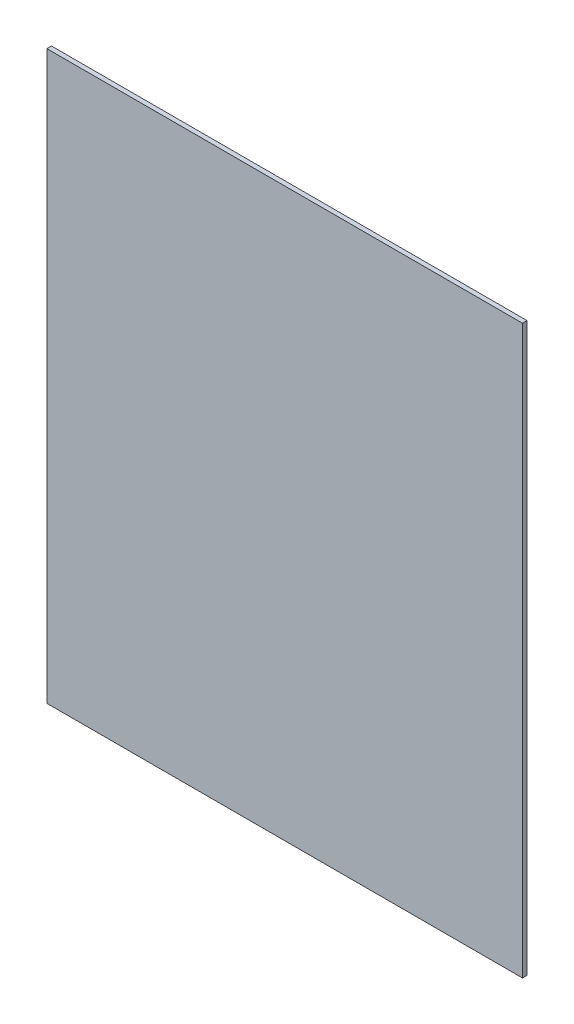
ISO-10303-21;
HEADER;
FILE_DESCRIPTION(('STEP AP214'),'2;1');
FILE_NAME('part.step','',(''),(''),'','','');
FILE_SCHEMA(('AUTOMOTIVE_DESIGN { 1 0 10303 214 1 1 1 1 }'));
ENDSEC;
DATA;
#1=APPLICATION_CONTEXT('core data for automotive mechanical design processes');
#2=APPLICATION_PROTOCOL_DEFINITION('international standard','automotive_design',2000,#1);
#3=PRODUCT_CONTEXT('',#1,'mechanical');
#4=PRODUCT('Part','Part','',(#3));
#5=PRODUCT_RELATED_PRODUCT_CATEGORY('part','',(#4));
#6=PRODUCT_DEFINITION_FORMATION('','',#4);
#7=PRODUCT_DEFINITION_CONTEXT('part definition',#1,'design');
#8=PRODUCT_DEFINITION('design','',#6,#7);
#9=PRODUCT_DEFINITION_SHAPE('','',#8);
#10=(LENGTH_UNIT() NAMED_UNIT(*) SI_UNIT(.MILLI.,.METRE.));
#11=(NAMED_UNIT(*) PLANE_ANGLE_UNIT() SI_UNIT($,.RADIAN.));
#12=(NAMED_UNIT(*) SI_UNIT($,.STERADIAN.) SOLID_ANGLE_UNIT());
#13=UNCERTAINTY_MEASURE_WITH_UNIT(LENGTH_MEASURE(1.E-05),#10,'distance_accuracy_value','');
#14=(GEOMETRIC_REPRESENTATION_CONTEXT(3) GLOBAL_UNCERTAINTY_ASSIGNED_CONTEXT((#13)) GLOBAL_UNIT_ASSIGNED_CONTEXT((#10,
#11,#12)) REPRESENTATION_CONTEXT('',''));
#15=CARTESIAN_POINT('',(0.,0.,0.));
#16=DIRECTION('',(0.,0.,1.));
#17=DIRECTION('',(1.,0.,0.));
#18=AXIS2_PLACEMENT_3D('',#15,#16,#17);
#19=CARTESIAN_POINT('',(0.,0.,1.5875));
#20=DIRECTION('',(-1.,0.,0.));
#21=DIRECTION('',(0.,0.,1.));
#22=AXIS2_PLACEMENT_3D('',#19,#20,#21);
#23=PLANE('',#22);
#24=DIRECTION('',(0.,1.,0.));
#25=VECTOR('',#24,1.);
#26=CARTESIAN_POINT('',(0.,0.,0.));
#27=LINE('',#26,#25);
#28=CARTESIAN_POINT('',(0.,0.,0.));
#29=VERTEX_POINT('',#28);
#30=CARTESIAN_POINT('',(0.,196.85,0.));
#31=VERTEX_POINT('',#30);
#32=EDGE_CURVE('E98',#29,#31,#27,.T.);
#33=ORIENTED_EDGE('',*,*,#32,.T.);
#34=DIRECTION('',(0.,0.,-1.));
#35=VECTOR('',#34,1.);
#36=CARTESIAN_POINT('',(0.,196.85,1.5875));
#37=LINE('',#36,#35);
#38=CARTESIAN_POINT('',(0.,196.85,1.5875));
#39=VERTEX_POINT('',#38);
#40=EDGE_CURVE('E11',#39,#31,#37,.T.);
#41=ORIENTED_EDGE('',*,*,#40,.F.);
#42=DIRECTION('',(0.,1.,0.));
#43=VECTOR('',#42,1.);
#44=CARTESIAN_POINT('',(0.,0.,1.5875));
#45=LINE('',#44,#43);
#46=CARTESIAN_POINT('',(0.,0.,1.5875));
#47=VERTEX_POINT('',#46);
#48=EDGE_CURVE('E86',#47,#39,#45,.T.);
#49=ORIENTED_EDGE('',*,*,#48,.F.);
#50=DIRECTION('',(0.,0.,-1.));
#51=VECTOR('',#50,1.);
#52=CARTESIAN_POINT('',(0.,0.,1.5875));
#53=LINE('',#52,#51);
#54=EDGE_CURVE('E94',#47,#29,#53,.T.);
#55=ORIENTED_EDGE('',*,*,#54,.T.);
#56=EDGE_LOOP('',(#33,#41,#49,#55));
#57=FACE_BOUND('',#56,.T.);
#58=ADVANCED_FACE('F35',(#57),#23,.F.);
#59=CARTESIAN_POINT('',(0.,196.85,1.5875));
#60=DIRECTION('',(0.,-1.,0.));
#61=DIRECTION('',(1.,0.,0.));
#62=AXIS2_PLACEMENT_3D('',#59,#60,#61);
#63=PLANE('',#62);
#64=DIRECTION('',(-1.,0.,0.));
#65=VECTOR('',#64,1.);
#66=CARTESIAN_POINT('',(0.,196.85,0.));
#67=LINE('',#66,#65);
#68=CARTESIAN_POINT('',(-165.1,196.85,0.));
#69=VERTEX_POINT('',#68);
#70=EDGE_CURVE('E90',#31,#69,#67,.T.);
#71=ORIENTED_EDGE('',*,*,#70,.T.);
#72=DIRECTION('',(0.,0.,-1.));
#73=VECTOR('',#72,1.);
#74=CARTESIAN_POINT('',(-165.1,196.85,1.5875));
#75=LINE('',#74,#73);
#76=CARTESIAN_POINT('',(-165.1,196.85,1.5875));
#77=VERTEX_POINT('',#76);
#78=EDGE_CURVE('E43',#77,#69,#75,.T.);
#79=ORIENTED_EDGE('',*,*,#78,.F.);
#80=DIRECTION('',(-1.,0.,0.));
#81=VECTOR('',#80,1.);
#82=CARTESIAN_POINT('',(0.,196.85,1.5875));
#83=LINE('',#82,#81);
#84=EDGE_CURVE('E81',#39,#77,#83,.T.);
#85=ORIENTED_EDGE('',*,*,#84,.F.);
#86=ORIENTED_EDGE('',*,*,#40,.T.);
#87=EDGE_LOOP('',(#71,#79,#85,#86));
#88=FACE_BOUND('',#87,.T.);
#89=ADVANCED_FACE('F89',(#88),#63,.F.);
#90=CARTESIAN_POINT('',(-165.1,0.,1.5875));
#91=DIRECTION('',(1.,0.,0.));
#92=DIRECTION('',(0.,0.,-1.));
#93=AXIS2_PLACEMENT_3D('',#90,#91,#92);
#94=PLANE('',#93);
#95=DIRECTION('',(0.,-1.,0.));
#96=VECTOR('',#95,1.);
#97=CARTESIAN_POINT('',(-165.1,0.,0.));
#98=LINE('',#97,#96);
#99=CARTESIAN_POINT('',(-165.1,0.,0.));
#100=VERTEX_POINT('',#99);
#101=EDGE_CURVE('E68',#69,#100,#98,.T.);
#102=ORIENTED_EDGE('',*,*,#101,.T.);
#103=DIRECTION('',(0.,0.,-1.));
#104=VECTOR('',#103,1.);
#105=CARTESIAN_POINT('',(-165.1,0.,1.5875));
#106=LINE('',#105,#104);
#107=CARTESIAN_POINT('',(-165.1,0.,1.5875));
#108=VERTEX_POINT('',#107);
#109=EDGE_CURVE('E91',#108,#100,#106,.T.);
#110=ORIENTED_EDGE('',*,*,#109,.F.);
#111=DIRECTION('',(0.,-1.,0.));
#112=VECTOR('',#111,1.);
#113=CARTESIAN_POINT('',(-165.1,0.,1.5875));
#114=LINE('',#113,#112);
#115=EDGE_CURVE('E84',#77,#108,#114,.T.);
#116=ORIENTED_EDGE('',*,*,#115,.F.);
#117=ORIENTED_EDGE('',*,*,#78,.T.);
#118=EDGE_LOOP('',(#102,#110,#116,#117));
#119=FACE_BOUND('',#118,.T.);
#120=ADVANCED_FACE('F92',(#119),#94,.F.);
#121=CARTESIAN_POINT('',(0.,0.,1.5875));
#122=DIRECTION('',(0.,1.,0.));
#123=DIRECTION('',(0.,0.,1.));
#124=AXIS2_PLACEMENT_3D('',#121,#122,#123);
#125=PLANE('',#124);
#126=DIRECTION('',(1.,0.,0.));
#127=VECTOR('',#126,1.);
#128=CARTESIAN_POINT('',(0.,0.,0.));
#129=LINE('',#128,#127);
#130=EDGE_CURVE('E74',#100,#29,#129,.T.);
#131=ORIENTED_EDGE('',*,*,#130,.T.);
#132=ORIENTED_EDGE('',*,*,#54,.F.);
#133=DIRECTION('',(1.,0.,0.));
#134=VECTOR('',#133,1.);
#135=CARTESIAN_POINT('',(0.,0.,1.5875));
#136=LINE('',#135,#134);
#137=EDGE_CURVE('E51',#108,#47,#136,.T.);
#138=ORIENTED_EDGE('',*,*,#137,.F.);
#139=ORIENTED_EDGE('',*,*,#109,.T.);
#140=EDGE_LOOP('',(#131,#132,#138,#139));
#141=FACE_BOUND('',#140,.T.);
#142=ADVANCED_FACE('F105',(#141),#125,.F.);
#143=CARTESIAN_POINT('',(0.,0.,1.5875));
#144=DIRECTION('',(0.,0.,1.));
#145=DIRECTION('',(1.,0.,0.));
#146=AXIS2_PLACEMENT_3D('',#143,#144,#145);
#147=PLANE('',#146);
#148=ORIENTED_EDGE('',*,*,#48,.T.);
#149=ORIENTED_EDGE('',*,*,#84,.T.);
#150=ORIENTED_EDGE('',*,*,#115,.T.);
#151=ORIENTED_EDGE('',*,*,#137,.T.);
#152=EDGE_LOOP('',(#148,#149,#150,#151));
#153=FACE_BOUND('',#152,.T.);
#154=ADVANCED_FACE('F82',(#153),#147,.T.);
#155=CARTESIAN_POINT('',(0.,0.,0.));
#156=DIRECTION('',(0.,0.,1.));
#157=DIRECTION('',(1.,0.,0.));
#158=AXIS2_PLACEMENT_3D('',#155,#156,#157);
#159=PLANE('',#158);
#160=ORIENTED_EDGE('',*,*,#32,.F.);
#161=ORIENTED_EDGE('',*,*,#130,.F.);
#162=ORIENTED_EDGE('',*,*,#101,.F.);
#163=ORIENTED_EDGE('',*,*,#70,.F.);
#164=EDGE_LOOP('',(#160,#161,#162,#163));
#165=FACE_BOUND('',#164,.T.);
#166=ADVANCED_FACE('F108',(#165),#159,.F.);
#167=CLOSED_SHELL('',(#58,#89,#120,#142,#154,#166));
#168=MANIFOLD_SOLID_BREP('B2',#167);
#169=ADVANCED_BREP_SHAPE_REPRESENTATION('',(#18,#168),#14);
#170=SHAPE_DEFINITION_REPRESENTATION(#9,#169);
ENDSEC;
END-ISO-10303-21;
